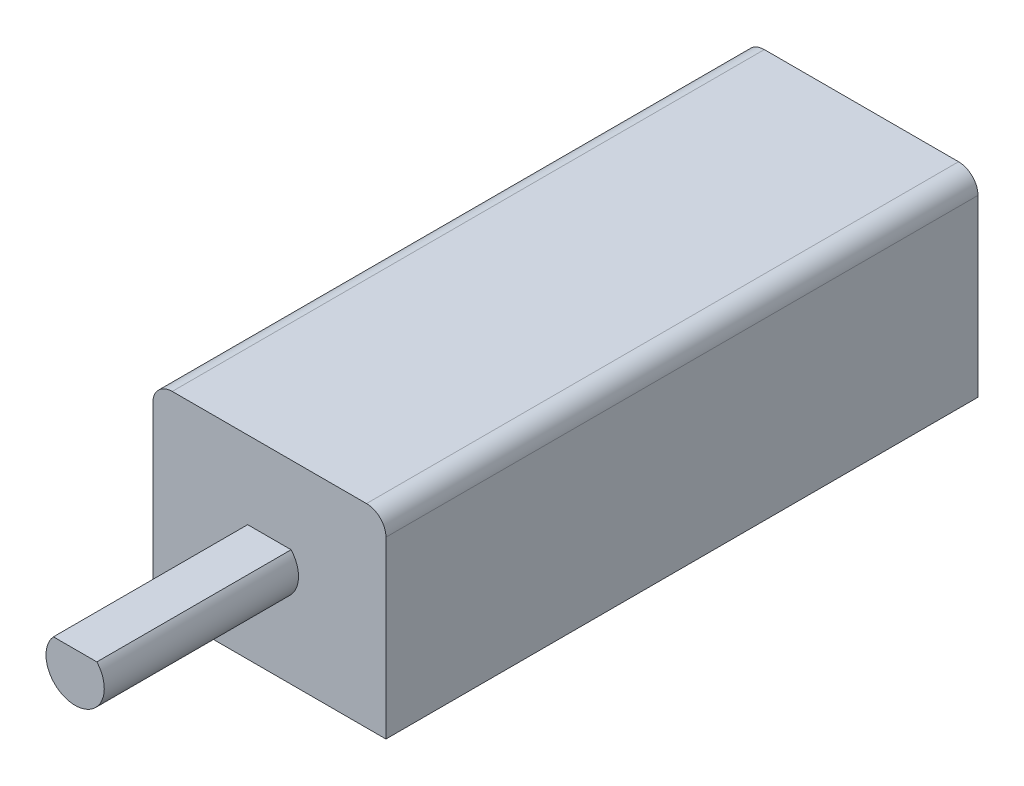
ISO-10303-21;
HEADER;
FILE_DESCRIPTION(('STEP AP214'),'2;1');
FILE_NAME('part.step','',(''),(''),'','','');
FILE_SCHEMA(('AUTOMOTIVE_DESIGN { 1 0 10303 214 1 1 1 1 }'));
ENDSEC;
DATA;
#1=APPLICATION_CONTEXT('core data for automotive mechanical design processes');
#2=APPLICATION_PROTOCOL_DEFINITION('international standard','automotive_design',2000,#1);
#3=PRODUCT_CONTEXT('',#1,'mechanical');
#4=PRODUCT('Part','Part','',(#3));
#5=PRODUCT_RELATED_PRODUCT_CATEGORY('part','',(#4));
#6=PRODUCT_DEFINITION_FORMATION('','',#4);
#7=PRODUCT_DEFINITION_CONTEXT('part definition',#1,'design');
#8=PRODUCT_DEFINITION('design','',#6,#7);
#9=PRODUCT_DEFINITION_SHAPE('','',#8);
#10=(LENGTH_UNIT() NAMED_UNIT(*) SI_UNIT(.MILLI.,.METRE.));
#11=(NAMED_UNIT(*) PLANE_ANGLE_UNIT() SI_UNIT($,.RADIAN.));
#12=(NAMED_UNIT(*) SI_UNIT($,.STERADIAN.) SOLID_ANGLE_UNIT());
#13=UNCERTAINTY_MEASURE_WITH_UNIT(LENGTH_MEASURE(1.E-05),#10,'distance_accuracy_value','');
#14=(GEOMETRIC_REPRESENTATION_CONTEXT(3) GLOBAL_UNCERTAINTY_ASSIGNED_CONTEXT((#13)) GLOBAL_UNIT_ASSIGNED_CONTEXT((#10,
#11,#12)) REPRESENTATION_CONTEXT('',''));
#15=CARTESIAN_POINT('',(0.,0.,0.));
#16=DIRECTION('',(0.,0.,1.));
#17=DIRECTION('',(1.,0.,0.));
#18=AXIS2_PLACEMENT_3D('',#15,#16,#17);
#19=CARTESIAN_POINT('',(6.,-5.,-40.48));
#20=DIRECTION('',(1.,0.,0.));
#21=DIRECTION('',(0.,0.,-1.));
#22=AXIS2_PLACEMENT_3D('',#19,#20,#21);
#23=PLANE('',#22);
#24=DIRECTION('',(0.,1.,0.));
#25=VECTOR('',#24,1.);
#26=CARTESIAN_POINT('',(6.,-5.,-40.48));
#27=LINE('',#26,#25);
#28=CARTESIAN_POINT('',(6.,-5.,-40.48));
#29=VERTEX_POINT('',#28);
#30=CARTESIAN_POINT('',(6.,4.,-40.48));
#31=VERTEX_POINT('',#30);
#32=EDGE_CURVE('E146',#29,#31,#27,.T.);
#33=ORIENTED_EDGE('',*,*,#32,.T.);
#34=DIRECTION('',(0.,0.,1.));
#35=VECTOR('',#34,1.);
#36=CARTESIAN_POINT('',(6.,4.,-40.48));
#37=LINE('',#36,#35);
#38=CARTESIAN_POINT('',(6.,4.,-10.));
#39=VERTEX_POINT('',#38);
#40=EDGE_CURVE('E165',#31,#39,#37,.T.);
#41=ORIENTED_EDGE('',*,*,#40,.T.);
#42=DIRECTION('',(0.,-1.,0.));
#43=VECTOR('',#42,1.);
#44=CARTESIAN_POINT('',(6.,-5.,-10.));
#45=LINE('',#44,#43);
#46=CARTESIAN_POINT('',(6.,-5.,-10.));
#47=VERTEX_POINT('',#46);
#48=EDGE_CURVE('E144',#39,#47,#45,.T.);
#49=ORIENTED_EDGE('',*,*,#48,.T.);
#50=DIRECTION('',(0.,0.,1.));
#51=VECTOR('',#50,1.);
#52=CARTESIAN_POINT('',(6.,-5.,-40.48));
#53=LINE('',#52,#51);
#54=EDGE_CURVE('E157',#29,#47,#53,.T.);
#55=ORIENTED_EDGE('',*,*,#54,.F.);
#56=EDGE_LOOP('',(#33,#41,#49,#55));
#57=FACE_BOUND('',#56,.T.);
#58=ADVANCED_FACE('F50',(#57),#23,.T.);
#59=CARTESIAN_POINT('',(-6.,-5.,-40.48));
#60=DIRECTION('',(0.,-1.,0.));
#61=DIRECTION('',(0.,0.,-1.));
#62=AXIS2_PLACEMENT_3D('',#59,#60,#61);
#63=PLANE('',#62);
#64=ORIENTED_EDGE('',*,*,#54,.T.);
#65=DIRECTION('',(-1.,0.,0.));
#66=VECTOR('',#65,1.);
#67=CARTESIAN_POINT('',(-6.,-5.,-10.));
#68=LINE('',#67,#66);
#69=CARTESIAN_POINT('',(-6.,-5.,-10.));
#70=VERTEX_POINT('',#69);
#71=EDGE_CURVE('E141',#47,#70,#68,.T.);
#72=ORIENTED_EDGE('',*,*,#71,.T.);
#73=DIRECTION('',(0.,0.,1.));
#74=VECTOR('',#73,1.);
#75=CARTESIAN_POINT('',(-6.,-5.,-40.48));
#76=LINE('',#75,#74);
#77=CARTESIAN_POINT('',(-6.,-5.,-40.48));
#78=VERTEX_POINT('',#77);
#79=EDGE_CURVE('E156',#78,#70,#76,.T.);
#80=ORIENTED_EDGE('',*,*,#79,.F.);
#81=DIRECTION('',(1.,0.,0.));
#82=VECTOR('',#81,1.);
#83=CARTESIAN_POINT('',(-6.,-5.,-40.48));
#84=LINE('',#83,#82);
#85=EDGE_CURVE('E153',#78,#29,#84,.T.);
#86=ORIENTED_EDGE('',*,*,#85,.T.);
#87=EDGE_LOOP('',(#64,#72,#80,#86));
#88=FACE_BOUND('',#87,.T.);
#89=ADVANCED_FACE('F197',(#88),#63,.T.);
#90=CARTESIAN_POINT('',(-6.,-5.,-40.48));
#91=DIRECTION('',(-1.,0.,0.));
#92=DIRECTION('',(0.,0.,1.));
#93=AXIS2_PLACEMENT_3D('',#90,#91,#92);
#94=PLANE('',#93);
#95=DIRECTION('',(0.,1.,0.));
#96=VECTOR('',#95,1.);
#97=CARTESIAN_POINT('',(-6.,-5.,-10.));
#98=LINE('',#97,#96);
#99=CARTESIAN_POINT('',(-6.,4.,-10.));
#100=VERTEX_POINT('',#99);
#101=EDGE_CURVE('E138',#70,#100,#98,.T.);
#102=ORIENTED_EDGE('',*,*,#101,.T.);
#103=DIRECTION('',(0.,0.,1.));
#104=VECTOR('',#103,1.);
#105=CARTESIAN_POINT('',(-6.,4.,-40.48));
#106=LINE('',#105,#104);
#107=CARTESIAN_POINT('',(-6.,4.,-40.48));
#108=VERTEX_POINT('',#107);
#109=EDGE_CURVE('E12',#100,#108,#106,.F.);
#110=ORIENTED_EDGE('',*,*,#109,.T.);
#111=DIRECTION('',(0.,-1.,0.));
#112=VECTOR('',#111,1.);
#113=CARTESIAN_POINT('',(-6.,-5.,-40.48));
#114=LINE('',#113,#112);
#115=EDGE_CURVE('E151',#108,#78,#114,.T.);
#116=ORIENTED_EDGE('',*,*,#115,.T.);
#117=ORIENTED_EDGE('',*,*,#79,.T.);
#118=EDGE_LOOP('',(#102,#110,#116,#117));
#119=FACE_BOUND('',#118,.T.);
#120=ADVANCED_FACE('F194',(#119),#94,.T.);
#121=CARTESIAN_POINT('',(-6.,5.,-40.48));
#122=DIRECTION('',(0.,1.,0.));
#123=DIRECTION('',(0.,0.,1.));
#124=AXIS2_PLACEMENT_3D('',#121,#122,#123);
#125=PLANE('',#124);
#126=DIRECTION('',(1.,0.,0.));
#127=VECTOR('',#126,1.);
#128=CARTESIAN_POINT('',(-6.,5.,-10.));
#129=LINE('',#128,#127);
#130=CARTESIAN_POINT('',(-5.,5.,-10.));
#131=VERTEX_POINT('',#130);
#132=CARTESIAN_POINT('',(5.,5.,-10.));
#133=VERTEX_POINT('',#132);
#134=EDGE_CURVE('E160',#131,#133,#129,.T.);
#135=ORIENTED_EDGE('',*,*,#134,.T.);
#136=DIRECTION('',(0.,0.,1.));
#137=VECTOR('',#136,1.);
#138=CARTESIAN_POINT('',(5.,5.,-40.48));
#139=LINE('',#138,#137);
#140=CARTESIAN_POINT('',(5.,5.,-40.48));
#141=VERTEX_POINT('',#140);
#142=EDGE_CURVE('E175',#133,#141,#139,.F.);
#143=ORIENTED_EDGE('',*,*,#142,.T.);
#144=DIRECTION('',(-1.,0.,0.));
#145=VECTOR('',#144,1.);
#146=CARTESIAN_POINT('',(-6.,5.,-40.48));
#147=LINE('',#146,#145);
#148=CARTESIAN_POINT('',(-5.,5.,-40.48));
#149=VERTEX_POINT('',#148);
#150=EDGE_CURVE('E149',#141,#149,#147,.T.);
#151=ORIENTED_EDGE('',*,*,#150,.T.);
#152=DIRECTION('',(0.,0.,1.));
#153=VECTOR('',#152,1.);
#154=CARTESIAN_POINT('',(-5.,5.,-40.48));
#155=LINE('',#154,#153);
#156=EDGE_CURVE('E172',#149,#131,#155,.T.);
#157=ORIENTED_EDGE('',*,*,#156,.T.);
#158=EDGE_LOOP('',(#135,#143,#151,#157));
#159=FACE_BOUND('',#158,.T.);
#160=ADVANCED_FACE('F191',(#159),#125,.T.);
#161=CARTESIAN_POINT('',(0.,0.,-40.48));
#162=DIRECTION('',(0.,0.,-1.));
#163=DIRECTION('',(-1.,0.,0.));
#164=AXIS2_PLACEMENT_3D('',#161,#162,#163);
#165=PLANE('',#164);
#166=ORIENTED_EDGE('',*,*,#150,.F.);
#167=CARTESIAN_POINT('',(5.,4.,-40.48));
#168=DIRECTION('',(0.,0.,-1.));
#169=DIRECTION('',(-1.,0.,0.));
#170=AXIS2_PLACEMENT_3D('',#167,#168,#169);
#171=CIRCLE('',#170,1.);
#172=EDGE_CURVE('E58',#141,#31,#171,.T.);
#173=ORIENTED_EDGE('',*,*,#172,.T.);
#174=ORIENTED_EDGE('',*,*,#32,.F.);
#175=ORIENTED_EDGE('',*,*,#85,.F.);
#176=ORIENTED_EDGE('',*,*,#115,.F.);
#177=CARTESIAN_POINT('',(-5.,4.,-40.48));
#178=DIRECTION('',(0.,0.,-1.));
#179=DIRECTION('',(-1.,0.,0.));
#180=AXIS2_PLACEMENT_3D('',#177,#178,#179);
#181=CIRCLE('',#180,1.);
#182=EDGE_CURVE('E70',#108,#149,#181,.T.);
#183=ORIENTED_EDGE('',*,*,#182,.T.);
#184=EDGE_LOOP('',(#166,#173,#174,#175,#176,#183));
#185=FACE_BOUND('',#184,.T.);
#186=ADVANCED_FACE('F179',(#185),#165,.T.);
#187=CARTESIAN_POINT('',(1.8157053634957,-1.17767073625237,-10.));
#188=DIRECTION('',(0.,0.,1.));
#189=DIRECTION('',(1.,0.,0.));
#190=AXIS2_PLACEMENT_3D('',#187,#188,#189);
#191=PLANE('',#190);
#192=ORIENTED_EDGE('',*,*,#48,.F.);
#193=CARTESIAN_POINT('',(5.,4.,-10.));
#194=DIRECTION('',(0.,0.,1.));
#195=DIRECTION('',(1.,0.,0.));
#196=AXIS2_PLACEMENT_3D('',#193,#194,#195);
#197=CIRCLE('',#196,1.);
#198=EDGE_CURVE('E170',#39,#133,#197,.T.);
#199=ORIENTED_EDGE('',*,*,#198,.T.);
#200=ORIENTED_EDGE('',*,*,#134,.F.);
#201=CARTESIAN_POINT('',(-5.,4.,-10.));
#202=DIRECTION('',(0.,0.,1.));
#203=DIRECTION('',(1.,0.,0.));
#204=AXIS2_PLACEMENT_3D('',#201,#202,#203);
#205=CIRCLE('',#204,1.);
#206=EDGE_CURVE('E168',#131,#100,#205,.T.);
#207=ORIENTED_EDGE('',*,*,#206,.T.);
#208=ORIENTED_EDGE('',*,*,#101,.F.);
#209=ORIENTED_EDGE('',*,*,#71,.F.);
#210=EDGE_LOOP('',(#192,#199,#200,#207,#208,#209));
#211=FACE_BOUND('',#210,.T.);
#212=DIRECTION('',(-1.,0.,0.));
#213=VECTOR('',#212,1.);
#214=CARTESIAN_POINT('',(-1.1180339887499,1.,-10.));
#215=LINE('',#214,#213);
#216=CARTESIAN_POINT('',(1.1180339887499,1.,-10.));
#217=VERTEX_POINT('',#216);
#218=CARTESIAN_POINT('',(-1.11803398874989,1.,-10.));
#219=VERTEX_POINT('',#218);
#220=EDGE_CURVE('E119',#217,#219,#215,.T.);
#221=ORIENTED_EDGE('',*,*,#220,.F.);
#222=CARTESIAN_POINT('',(0.,0.,-10.));
#223=DIRECTION('',(0.,0.,1.));
#224=DIRECTION('',(1.,0.,0.));
#225=AXIS2_PLACEMENT_3D('',#222,#223,#224);
#226=CIRCLE('',#225,1.5);
#227=EDGE_CURVE('E129',#219,#217,#226,.T.);
#228=ORIENTED_EDGE('',*,*,#227,.F.);
#229=EDGE_LOOP('',(#221,#228));
#230=FACE_BOUND('',#229,.T.);
#231=ADVANCED_FACE('F128',(#211,#230),#191,.T.);
#232=CARTESIAN_POINT('',(0.,0.,-10.));
#233=DIRECTION('',(0.,0.,1.));
#234=DIRECTION('',(1.,0.,0.));
#235=AXIS2_PLACEMENT_3D('',#232,#233,#234);
#236=CYLINDRICAL_SURFACE('',#235,1.5);
#237=CARTESIAN_POINT('',(0.,0.,0.));
#238=DIRECTION('',(0.,0.,1.));
#239=DIRECTION('',(1.,0.,0.));
#240=AXIS2_PLACEMENT_3D('',#237,#238,#239);
#241=CIRCLE('',#240,1.5);
#242=CARTESIAN_POINT('',(-1.1180339887499,1.,0.));
#243=VERTEX_POINT('',#242);
#244=CARTESIAN_POINT('',(1.1180339887499,1.,0.));
#245=VERTEX_POINT('',#244);
#246=EDGE_CURVE('E134',#243,#245,#241,.T.);
#247=ORIENTED_EDGE('',*,*,#246,.F.);
#248=DIRECTION('',(0.,0.,1.));
#249=VECTOR('',#248,1.);
#250=CARTESIAN_POINT('',(-1.1180339887499,1.,-10.));
#251=LINE('',#250,#249);
#252=EDGE_CURVE('E125',#219,#243,#251,.T.);
#253=ORIENTED_EDGE('',*,*,#252,.F.);
#254=ORIENTED_EDGE('',*,*,#227,.T.);
#255=DIRECTION('',(0.,0.,1.));
#256=VECTOR('',#255,1.);
#257=CARTESIAN_POINT('',(1.1180339887499,1.,-10.));
#258=LINE('',#257,#256);
#259=EDGE_CURVE('E115',#217,#245,#258,.T.);
#260=ORIENTED_EDGE('',*,*,#259,.T.);
#261=EDGE_LOOP('',(#247,#253,#254,#260));
#262=FACE_BOUND('',#261,.T.);
#263=ADVANCED_FACE('F132',(#262),#236,.T.);
#264=CARTESIAN_POINT('',(-1.1180339887499,1.,-10.));
#265=DIRECTION('',(0.,1.,0.));
#266=DIRECTION('',(0.,0.,1.));
#267=AXIS2_PLACEMENT_3D('',#264,#265,#266);
#268=PLANE('',#267);
#269=DIRECTION('',(-1.,0.,0.));
#270=VECTOR('',#269,1.);
#271=CARTESIAN_POINT('',(-1.1180339887499,1.,0.));
#272=LINE('',#271,#270);
#273=EDGE_CURVE('E121',#245,#243,#272,.T.);
#274=ORIENTED_EDGE('',*,*,#273,.F.);
#275=ORIENTED_EDGE('',*,*,#259,.F.);
#276=ORIENTED_EDGE('',*,*,#220,.T.);
#277=ORIENTED_EDGE('',*,*,#252,.T.);
#278=EDGE_LOOP('',(#274,#275,#276,#277));
#279=FACE_BOUND('',#278,.T.);
#280=ADVANCED_FACE('F117',(#279),#268,.T.);
#281=CARTESIAN_POINT('',(0.,0.,0.));
#282=DIRECTION('',(0.,0.,-1.));
#283=DIRECTION('',(-1.,0.,0.));
#284=AXIS2_PLACEMENT_3D('',#281,#282,#283);
#285=PLANE('',#284);
#286=ORIENTED_EDGE('',*,*,#246,.T.);
#287=ORIENTED_EDGE('',*,*,#273,.T.);
#288=EDGE_LOOP('',(#286,#287));
#289=FACE_BOUND('',#288,.T.);
#290=ADVANCED_FACE('F207',(#289),#285,.F.);
#291=CARTESIAN_POINT('',(5.,4.,-40.48));
#292=DIRECTION('',(0.,0.,1.));
#293=DIRECTION('',(1.,0.,0.));
#294=AXIS2_PLACEMENT_3D('',#291,#292,#293);
#295=CYLINDRICAL_SURFACE('',#294,1.);
#296=ORIENTED_EDGE('',*,*,#172,.F.);
#297=ORIENTED_EDGE('',*,*,#142,.F.);
#298=ORIENTED_EDGE('',*,*,#198,.F.);
#299=ORIENTED_EDGE('',*,*,#40,.F.);
#300=EDGE_LOOP('',(#296,#297,#298,#299));
#301=FACE_BOUND('',#300,.T.);
#302=ADVANCED_FACE('F186',(#301),#295,.T.);
#303=CARTESIAN_POINT('',(-5.,4.,-40.48));
#304=DIRECTION('',(0.,0.,1.));
#305=DIRECTION('',(1.,0.,0.));
#306=AXIS2_PLACEMENT_3D('',#303,#304,#305);
#307=CYLINDRICAL_SURFACE('',#306,1.);
#308=ORIENTED_EDGE('',*,*,#182,.F.);
#309=ORIENTED_EDGE('',*,*,#109,.F.);
#310=ORIENTED_EDGE('',*,*,#206,.F.);
#311=ORIENTED_EDGE('',*,*,#156,.F.);
#312=EDGE_LOOP('',(#308,#309,#310,#311));
#313=FACE_BOUND('',#312,.T.);
#314=ADVANCED_FACE('F52',(#313),#307,.T.);
#315=CLOSED_SHELL('',(#58,#89,#120,#160,#186,#231,#263,#280,#290,#302,#314));
#316=MANIFOLD_SOLID_BREP('B2',#315);
#317=ADVANCED_BREP_SHAPE_REPRESENTATION('',(#18,#316),#14);
#318=SHAPE_DEFINITION_REPRESENTATION(#9,#317);
ENDSEC;
END-ISO-10303-21;
